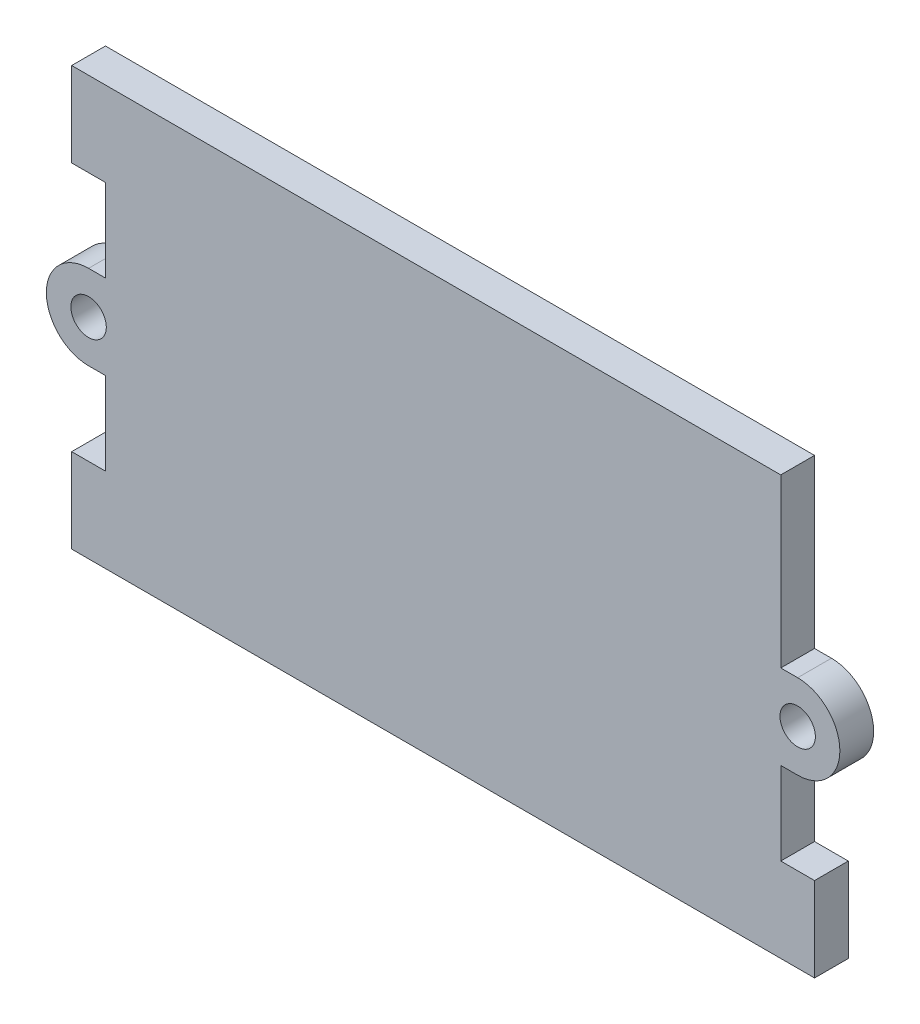
ISO-10303-21;
HEADER;
FILE_DESCRIPTION(('STEP AP214'),'2;1');
FILE_NAME('part.step','',(''),(''),'','','');
FILE_SCHEMA(('AUTOMOTIVE_DESIGN { 1 0 10303 214 1 1 1 1 }'));
ENDSEC;
DATA;
#1=APPLICATION_CONTEXT('core data for automotive mechanical design processes');
#2=APPLICATION_PROTOCOL_DEFINITION('international standard','automotive_design',2000,#1);
#3=PRODUCT_CONTEXT('',#1,'mechanical');
#4=PRODUCT('Part','Part','',(#3));
#5=PRODUCT_RELATED_PRODUCT_CATEGORY('part','',(#4));
#6=PRODUCT_DEFINITION_FORMATION('','',#4);
#7=PRODUCT_DEFINITION_CONTEXT('part definition',#1,'design');
#8=PRODUCT_DEFINITION('design','',#6,#7);
#9=PRODUCT_DEFINITION_SHAPE('','',#8);
#10=(LENGTH_UNIT() NAMED_UNIT(*) SI_UNIT(.MILLI.,.METRE.));
#11=(NAMED_UNIT(*) PLANE_ANGLE_UNIT() SI_UNIT($,.RADIAN.));
#12=(NAMED_UNIT(*) SI_UNIT($,.STERADIAN.) SOLID_ANGLE_UNIT());
#13=UNCERTAINTY_MEASURE_WITH_UNIT(LENGTH_MEASURE(1.E-05),#10,'distance_accuracy_value','');
#14=(GEOMETRIC_REPRESENTATION_CONTEXT(3) GLOBAL_UNCERTAINTY_ASSIGNED_CONTEXT((#13)) GLOBAL_UNIT_ASSIGNED_CONTEXT((#10,
#11,#12)) REPRESENTATION_CONTEXT('',''));
#15=CARTESIAN_POINT('',(0.,0.,0.));
#16=DIRECTION('',(0.,0.,1.));
#17=DIRECTION('',(1.,0.,0.));
#18=AXIS2_PLACEMENT_3D('',#15,#16,#17);
#19=CARTESIAN_POINT('',(80.,0.,4.));
#20=DIRECTION('',(-1.,0.,0.));
#21=DIRECTION('',(0.,0.,1.));
#22=AXIS2_PLACEMENT_3D('',#19,#20,#21);
#23=PLANE('',#22);
#24=DIRECTION('',(0.,0.,1.));
#25=VECTOR('',#24,1.);
#26=CARTESIAN_POINT('',(80.,10.,0.));
#27=LINE('',#26,#25);
#28=CARTESIAN_POINT('',(80.,10.,0.));
#29=VERTEX_POINT('',#28);
#30=CARTESIAN_POINT('',(80.,10.,4.));
#31=VERTEX_POINT('',#30);
#32=EDGE_CURVE('E168',#29,#31,#27,.T.);
#33=ORIENTED_EDGE('',*,*,#32,.F.);
#34=DIRECTION('',(0.,1.,0.));
#35=VECTOR('',#34,1.);
#36=CARTESIAN_POINT('',(80.,0.,0.));
#37=LINE('',#36,#35);
#38=CARTESIAN_POINT('',(80.,19.8074069840839,0.));
#39=VERTEX_POINT('',#38);
#40=EDGE_CURVE('E156',#29,#39,#37,.T.);
#41=ORIENTED_EDGE('',*,*,#40,.T.);
#42=DIRECTION('',(0.,0.,1.));
#43=VECTOR('',#42,1.);
#44=CARTESIAN_POINT('',(80.,19.8074069840839,0.));
#45=LINE('',#44,#43);
#46=CARTESIAN_POINT('',(80.,19.8074069840839,4.));
#47=VERTEX_POINT('',#46);
#48=EDGE_CURVE('E209',#39,#47,#45,.T.);
#49=ORIENTED_EDGE('',*,*,#48,.T.);
#50=DIRECTION('',(0.,1.,0.));
#51=VECTOR('',#50,1.);
#52=CARTESIAN_POINT('',(80.,0.,4.));
#53=LINE('',#52,#51);
#54=EDGE_CURVE('E47',#31,#47,#53,.T.);
#55=ORIENTED_EDGE('',*,*,#54,.F.);
#56=EDGE_LOOP('',(#33,#41,#49,#55));
#57=FACE_BOUND('',#56,.T.);
#58=ADVANCED_FACE('F32',(#57),#23,.F.);
#59=DIRECTION('',(0.,0.,1.));
#60=VECTOR('',#59,1.);
#61=CARTESIAN_POINT('',(80.,29.8074069840839,0.));
#62=LINE('',#61,#60);
#63=CARTESIAN_POINT('',(80.,29.8074069840839,0.));
#64=VERTEX_POINT('',#63);
#65=CARTESIAN_POINT('',(80.,29.8074069840839,4.));
#66=VERTEX_POINT('',#65);
#67=EDGE_CURVE('E207',#64,#66,#62,.T.);
#68=ORIENTED_EDGE('',*,*,#67,.F.);
#69=CARTESIAN_POINT('',(80.,49.6148139681679,0.));
#70=VERTEX_POINT('',#69);
#71=EDGE_CURVE('E166',#64,#70,#37,.T.);
#72=ORIENTED_EDGE('',*,*,#71,.T.);
#73=DIRECTION('',(0.,0.,-1.));
#74=VECTOR('',#73,1.);
#75=CARTESIAN_POINT('',(80.,49.6148139681679,4.));
#76=LINE('',#75,#74);
#77=CARTESIAN_POINT('',(80.,49.6148139681679,4.));
#78=VERTEX_POINT('',#77);
#79=EDGE_CURVE('E11',#78,#70,#76,.T.);
#80=ORIENTED_EDGE('',*,*,#79,.F.);
#81=EDGE_CURVE('E277',#66,#78,#53,.T.);
#82=ORIENTED_EDGE('',*,*,#81,.F.);
#83=EDGE_LOOP('',(#68,#72,#80,#82));
#84=FACE_BOUND('',#83,.T.);
#85=ADVANCED_FACE('F317',(#84),#23,.F.);
#86=CARTESIAN_POINT('',(0.,0.,4.));
#87=DIRECTION('',(-1.,0.,0.));
#88=DIRECTION('',(0.,-1.,0.));
#89=AXIS2_PLACEMENT_3D('',#86,#87,#88);
#90=PLANE('',#89);
#91=DIRECTION('',(0.,1.,0.));
#92=VECTOR('',#91,1.);
#93=CARTESIAN_POINT('',(0.,0.,4.));
#94=LINE('',#93,#92);
#95=CARTESIAN_POINT('',(0.,29.8074069840839,4.));
#96=VERTEX_POINT('',#95);
#97=CARTESIAN_POINT('',(0.,39.6148139681679,4.));
#98=VERTEX_POINT('',#97);
#99=EDGE_CURVE('E283',#96,#98,#94,.T.);
#100=ORIENTED_EDGE('',*,*,#99,.T.);
#101=DIRECTION('',(0.,0.,1.));
#102=VECTOR('',#101,1.);
#103=CARTESIAN_POINT('',(0.,39.6148139681679,0.));
#104=LINE('',#103,#102);
#105=CARTESIAN_POINT('',(0.,39.6148139681679,0.));
#106=VERTEX_POINT('',#105);
#107=EDGE_CURVE('E230',#106,#98,#104,.T.);
#108=ORIENTED_EDGE('',*,*,#107,.F.);
#109=DIRECTION('',(0.,1.,0.));
#110=VECTOR('',#109,1.);
#111=CARTESIAN_POINT('',(0.,0.,0.));
#112=LINE('',#111,#110);
#113=CARTESIAN_POINT('',(0.,29.8074069840839,0.));
#114=VERTEX_POINT('',#113);
#115=EDGE_CURVE('E288',#114,#106,#112,.T.);
#116=ORIENTED_EDGE('',*,*,#115,.F.);
#117=DIRECTION('',(0.,0.,1.));
#118=VECTOR('',#117,1.);
#119=CARTESIAN_POINT('',(0.,29.8074069840839,0.));
#120=LINE('',#119,#118);
#121=EDGE_CURVE('E241',#114,#96,#120,.T.);
#122=ORIENTED_EDGE('',*,*,#121,.T.);
#123=EDGE_LOOP('',(#100,#108,#116,#122));
#124=FACE_BOUND('',#123,.T.);
#125=ADVANCED_FACE('F298',(#124),#90,.T.);
#126=CARTESIAN_POINT('',(0.,10.,4.));
#127=VERTEX_POINT('',#126);
#128=CARTESIAN_POINT('',(0.,19.8074069840839,4.));
#129=VERTEX_POINT('',#128);
#130=EDGE_CURVE('E40',#127,#129,#94,.T.);
#131=ORIENTED_EDGE('',*,*,#130,.T.);
#132=DIRECTION('',(0.,0.,1.));
#133=VECTOR('',#132,1.);
#134=CARTESIAN_POINT('',(0.,19.8074069840839,0.));
#135=LINE('',#134,#133);
#136=CARTESIAN_POINT('',(0.,19.8074069840839,0.));
#137=VERTEX_POINT('',#136);
#138=EDGE_CURVE('E254',#137,#129,#135,.T.);
#139=ORIENTED_EDGE('',*,*,#138,.F.);
#140=CARTESIAN_POINT('',(0.,10.,0.));
#141=VERTEX_POINT('',#140);
#142=EDGE_CURVE('E278',#141,#137,#112,.T.);
#143=ORIENTED_EDGE('',*,*,#142,.F.);
#144=DIRECTION('',(0.,0.,1.));
#145=VECTOR('',#144,1.);
#146=CARTESIAN_POINT('',(0.,10.,0.));
#147=LINE('',#146,#145);
#148=EDGE_CURVE('E263',#141,#127,#147,.T.);
#149=ORIENTED_EDGE('',*,*,#148,.T.);
#150=EDGE_LOOP('',(#131,#139,#143,#149));
#151=FACE_BOUND('',#150,.T.);
#152=ADVANCED_FACE('F344',(#151),#90,.T.);
#153=CARTESIAN_POINT('',(0.,0.,4.));
#154=DIRECTION('',(0.,1.,0.));
#155=DIRECTION('',(0.,0.,1.));
#156=AXIS2_PLACEMENT_3D('',#153,#154,#155);
#157=PLANE('',#156);
#158=DIRECTION('',(1.,0.,0.));
#159=VECTOR('',#158,1.);
#160=CARTESIAN_POINT('',(0.,0.,0.));
#161=LINE('',#160,#159);
#162=CARTESIAN_POINT('',(-4.,0.,0.));
#163=VERTEX_POINT('',#162);
#164=CARTESIAN_POINT('',(84.,0.,0.));
#165=VERTEX_POINT('',#164);
#166=EDGE_CURVE('E274',#163,#165,#161,.T.);
#167=ORIENTED_EDGE('',*,*,#166,.T.);
#168=DIRECTION('',(0.,0.,1.));
#169=VECTOR('',#168,1.);
#170=CARTESIAN_POINT('',(84.,0.,0.));
#171=LINE('',#170,#169);
#172=CARTESIAN_POINT('',(84.,0.,4.));
#173=VERTEX_POINT('',#172);
#174=EDGE_CURVE('E179',#165,#173,#171,.T.);
#175=ORIENTED_EDGE('',*,*,#174,.T.);
#176=DIRECTION('',(1.,0.,0.));
#177=VECTOR('',#176,1.);
#178=CARTESIAN_POINT('',(0.,0.,4.));
#179=LINE('',#178,#177);
#180=CARTESIAN_POINT('',(-4.,0.,4.));
#181=VERTEX_POINT('',#180);
#182=EDGE_CURVE('E275',#181,#173,#179,.T.);
#183=ORIENTED_EDGE('',*,*,#182,.F.);
#184=DIRECTION('',(0.,0.,1.));
#185=VECTOR('',#184,1.);
#186=CARTESIAN_POINT('',(-4.,0.,0.));
#187=LINE('',#186,#185);
#188=EDGE_CURVE('E271',#163,#181,#187,.T.);
#189=ORIENTED_EDGE('',*,*,#188,.F.);
#190=EDGE_LOOP('',(#167,#175,#183,#189));
#191=FACE_BOUND('',#190,.T.);
#192=ADVANCED_FACE('F34',(#191),#157,.F.);
#193=CARTESIAN_POINT('',(0.,49.6148139681679,4.));
#194=DIRECTION('',(0.,1.,0.));
#195=DIRECTION('',(0.,0.,1.));
#196=AXIS2_PLACEMENT_3D('',#193,#194,#195);
#197=PLANE('',#196);
#198=DIRECTION('',(1.,0.,0.));
#199=VECTOR('',#198,1.);
#200=CARTESIAN_POINT('',(0.,49.6148139681679,0.));
#201=LINE('',#200,#199);
#202=CARTESIAN_POINT('',(-3.99999999999999,49.6148139681679,0.));
#203=VERTEX_POINT('',#202);
#204=EDGE_CURVE('E165',#203,#70,#201,.T.);
#205=ORIENTED_EDGE('',*,*,#204,.F.);
#206=DIRECTION('',(0.,0.,1.));
#207=VECTOR('',#206,1.);
#208=CARTESIAN_POINT('',(-3.99999999999999,49.6148139681679,0.));
#209=LINE('',#208,#207);
#210=CARTESIAN_POINT('',(-3.99999999999999,49.6148139681679,4.));
#211=VERTEX_POINT('',#210);
#212=EDGE_CURVE('E221',#203,#211,#209,.T.);
#213=ORIENTED_EDGE('',*,*,#212,.T.);
#214=DIRECTION('',(1.,0.,0.));
#215=VECTOR('',#214,1.);
#216=CARTESIAN_POINT('',(0.,49.6148139681679,4.));
#217=LINE('',#216,#215);
#218=EDGE_CURVE('E280',#211,#78,#217,.T.);
#219=ORIENTED_EDGE('',*,*,#218,.T.);
#220=ORIENTED_EDGE('',*,*,#79,.T.);
#221=EDGE_LOOP('',(#205,#213,#219,#220));
#222=FACE_BOUND('',#221,.T.);
#223=ADVANCED_FACE('F311',(#222),#197,.T.);
#224=CARTESIAN_POINT('',(0.,0.,4.));
#225=DIRECTION('',(0.,0.,1.));
#226=DIRECTION('',(1.,0.,0.));
#227=AXIS2_PLACEMENT_3D('',#224,#225,#226);
#228=PLANE('',#227);
#229=CARTESIAN_POINT('',(-2.,24.8074069840839,4.));
#230=DIRECTION('',(0.,0.,-1.));
#231=DIRECTION('',(-1.,0.,0.));
#232=AXIS2_PLACEMENT_3D('',#229,#230,#231);
#233=CIRCLE('',#232,2.1);
#234=CARTESIAN_POINT('',(-4.1,24.8074069840839,4.));
#235=VERTEX_POINT('',#234);
#236=EDGE_CURVE('E188',#235,#235,#233,.T.);
#237=ORIENTED_EDGE('',*,*,#236,.T.);
#238=EDGE_LOOP('',(#237));
#239=FACE_BOUND('',#238,.T.);
#240=CARTESIAN_POINT('',(82.,24.8074069840839,4.));
#241=DIRECTION('',(0.,0.,-1.));
#242=DIRECTION('',(-1.,0.,0.));
#243=AXIS2_PLACEMENT_3D('',#240,#241,#242);
#244=CIRCLE('',#243,2.1);
#245=CARTESIAN_POINT('',(79.9,24.8074069840839,4.));
#246=VERTEX_POINT('',#245);
#247=EDGE_CURVE('E459',#246,#246,#244,.T.);
#248=ORIENTED_EDGE('',*,*,#247,.T.);
#249=EDGE_LOOP('',(#248));
#250=FACE_BOUND('',#249,.T.);
#251=ORIENTED_EDGE('',*,*,#182,.T.);
#252=DIRECTION('',(0.,-1.,0.));
#253=VECTOR('',#252,1.);
#254=CARTESIAN_POINT('',(84.,0.,4.));
#255=LINE('',#254,#253);
#256=CARTESIAN_POINT('',(84.,10.,4.));
#257=VERTEX_POINT('',#256);
#258=EDGE_CURVE('E177',#257,#173,#255,.T.);
#259=ORIENTED_EDGE('',*,*,#258,.F.);
#260=DIRECTION('',(1.,0.,0.));
#261=VECTOR('',#260,1.);
#262=CARTESIAN_POINT('',(80.,10.,4.));
#263=LINE('',#262,#261);
#264=EDGE_CURVE('E182',#31,#257,#263,.T.);
#265=ORIENTED_EDGE('',*,*,#264,.F.);
#266=ORIENTED_EDGE('',*,*,#54,.T.);
#267=DIRECTION('',(-1.,0.,0.));
#268=VECTOR('',#267,1.);
#269=CARTESIAN_POINT('',(80.,19.8074069840839,4.));
#270=LINE('',#269,#268);
#271=CARTESIAN_POINT('',(82.,19.8074069840839,4.));
#272=VERTEX_POINT('',#271);
#273=EDGE_CURVE('E202',#272,#47,#270,.T.);
#274=ORIENTED_EDGE('',*,*,#273,.F.);
#275=CARTESIAN_POINT('',(82.,24.8074069840839,4.));
#276=DIRECTION('',(0.,0.,-1.));
#277=DIRECTION('',(1.,0.,0.));
#278=AXIS2_PLACEMENT_3D('',#275,#276,#277);
#279=CIRCLE('',#278,5.00000000000002);
#280=CARTESIAN_POINT('',(82.,29.8074069840839,4.));
#281=VERTEX_POINT('',#280);
#282=EDGE_CURVE('E170',#281,#272,#279,.T.);
#283=ORIENTED_EDGE('',*,*,#282,.F.);
#284=DIRECTION('',(1.,0.,0.));
#285=VECTOR('',#284,1.);
#286=CARTESIAN_POINT('',(80.,29.8074069840839,4.));
#287=LINE('',#286,#285);
#288=EDGE_CURVE('E195',#66,#281,#287,.T.);
#289=ORIENTED_EDGE('',*,*,#288,.F.);
#290=ORIENTED_EDGE('',*,*,#81,.T.);
#291=ORIENTED_EDGE('',*,*,#218,.F.);
#292=DIRECTION('',(0.,1.,0.));
#293=VECTOR('',#292,1.);
#294=CARTESIAN_POINT('',(-3.99999999999999,49.6148139681679,4.));
#295=LINE('',#294,#293);
#296=CARTESIAN_POINT('',(-4.,39.6148139681679,4.));
#297=VERTEX_POINT('',#296);
#298=EDGE_CURVE('E218',#297,#211,#295,.T.);
#299=ORIENTED_EDGE('',*,*,#298,.F.);
#300=DIRECTION('',(-1.,0.,0.));
#301=VECTOR('',#300,1.);
#302=CARTESIAN_POINT('',(0.,39.6148139681679,4.));
#303=LINE('',#302,#301);
#304=EDGE_CURVE('E214',#98,#297,#303,.T.);
#305=ORIENTED_EDGE('',*,*,#304,.F.);
#306=ORIENTED_EDGE('',*,*,#99,.F.);
#307=DIRECTION('',(1.,0.,0.));
#308=VECTOR('',#307,1.);
#309=CARTESIAN_POINT('',(0.,29.8074069840839,4.));
#310=LINE('',#309,#308);
#311=CARTESIAN_POINT('',(-2.,29.8074069840839,4.));
#312=VERTEX_POINT('',#311);
#313=EDGE_CURVE('E236',#312,#96,#310,.T.);
#314=ORIENTED_EDGE('',*,*,#313,.F.);
#315=CARTESIAN_POINT('',(-2.,24.8074069840839,4.));
#316=DIRECTION('',(0.,0.,-1.));
#317=DIRECTION('',(-1.,0.,0.));
#318=AXIS2_PLACEMENT_3D('',#315,#316,#317);
#319=CIRCLE('',#318,5.);
#320=CARTESIAN_POINT('',(-2.,19.8074069840839,4.));
#321=VERTEX_POINT('',#320);
#322=EDGE_CURVE('E243',#321,#312,#319,.T.);
#323=ORIENTED_EDGE('',*,*,#322,.F.);
#324=DIRECTION('',(-1.,0.,0.));
#325=VECTOR('',#324,1.);
#326=CARTESIAN_POINT('',(0.,19.8074069840839,4.));
#327=LINE('',#326,#325);
#328=EDGE_CURVE('E232',#129,#321,#327,.T.);
#329=ORIENTED_EDGE('',*,*,#328,.F.);
#330=ORIENTED_EDGE('',*,*,#130,.F.);
#331=DIRECTION('',(1.,0.,0.));
#332=VECTOR('',#331,1.);
#333=CARTESIAN_POINT('',(0.,10.,4.));
#334=LINE('',#333,#332);
#335=CARTESIAN_POINT('',(-4.,10.,4.));
#336=VERTEX_POINT('',#335);
#337=EDGE_CURVE('E261',#336,#127,#334,.T.);
#338=ORIENTED_EDGE('',*,*,#337,.F.);
#339=DIRECTION('',(0.,1.,0.));
#340=VECTOR('',#339,1.);
#341=CARTESIAN_POINT('',(-4.,0.,4.));
#342=LINE('',#341,#340);
#343=EDGE_CURVE('E257',#181,#336,#342,.T.);
#344=ORIENTED_EDGE('',*,*,#343,.F.);
#345=EDGE_LOOP('',(#251,#259,#265,#266,#274,#283,#289,#290,#291,#299,#305,#306,#314,#323,#329,
#330,#338,#344));
#346=FACE_BOUND('',#345,.T.);
#347=ADVANCED_FACE('F304',(#239,#250,#346),#228,.T.);
#348=CARTESIAN_POINT('',(0.,0.,0.));
#349=DIRECTION('',(0.,0.,1.));
#350=DIRECTION('',(1.,0.,0.));
#351=AXIS2_PLACEMENT_3D('',#348,#349,#350);
#352=PLANE('',#351);
#353=CARTESIAN_POINT('',(-2.,24.8074069840839,0.));
#354=DIRECTION('',(0.,0.,-1.));
#355=DIRECTION('',(-1.,0.,0.));
#356=AXIS2_PLACEMENT_3D('',#353,#354,#355);
#357=CIRCLE('',#356,2.1);
#358=CARTESIAN_POINT('',(-4.1,24.8074069840839,0.));
#359=VERTEX_POINT('',#358);
#360=EDGE_CURVE('E458',#359,#359,#357,.T.);
#361=ORIENTED_EDGE('',*,*,#360,.F.);
#362=EDGE_LOOP('',(#361));
#363=FACE_BOUND('',#362,.T.);
#364=CARTESIAN_POINT('',(82.,24.8074069840839,0.));
#365=DIRECTION('',(0.,0.,-1.));
#366=DIRECTION('',(-1.,0.,0.));
#367=AXIS2_PLACEMENT_3D('',#364,#365,#366);
#368=CIRCLE('',#367,2.1);
#369=CARTESIAN_POINT('',(79.9,24.8074069840839,0.));
#370=VERTEX_POINT('',#369);
#371=EDGE_CURVE('E185',#370,#370,#368,.T.);
#372=ORIENTED_EDGE('',*,*,#371,.F.);
#373=EDGE_LOOP('',(#372));
#374=FACE_BOUND('',#373,.T.);
#375=ORIENTED_EDGE('',*,*,#166,.F.);
#376=DIRECTION('',(0.,1.,0.));
#377=VECTOR('',#376,1.);
#378=CARTESIAN_POINT('',(-4.,0.,0.));
#379=LINE('',#378,#377);
#380=CARTESIAN_POINT('',(-4.,10.,0.));
#381=VERTEX_POINT('',#380);
#382=EDGE_CURVE('E258',#163,#381,#379,.T.);
#383=ORIENTED_EDGE('',*,*,#382,.T.);
#384=DIRECTION('',(1.,0.,0.));
#385=VECTOR('',#384,1.);
#386=CARTESIAN_POINT('',(0.,10.,0.));
#387=LINE('',#386,#385);
#388=EDGE_CURVE('E260',#381,#141,#387,.T.);
#389=ORIENTED_EDGE('',*,*,#388,.T.);
#390=ORIENTED_EDGE('',*,*,#142,.T.);
#391=DIRECTION('',(-1.,0.,0.));
#392=VECTOR('',#391,1.);
#393=CARTESIAN_POINT('',(0.,19.8074069840839,0.));
#394=LINE('',#393,#392);
#395=CARTESIAN_POINT('',(-2.,19.8074069840839,0.));
#396=VERTEX_POINT('',#395);
#397=EDGE_CURVE('E233',#137,#396,#394,.T.);
#398=ORIENTED_EDGE('',*,*,#397,.T.);
#399=CARTESIAN_POINT('',(-2.,24.8074069840839,0.));
#400=DIRECTION('',(0.,0.,-1.));
#401=DIRECTION('',(-1.,0.,0.));
#402=AXIS2_PLACEMENT_3D('',#399,#400,#401);
#403=CIRCLE('',#402,5.);
#404=CARTESIAN_POINT('',(-2.,29.8074069840839,0.));
#405=VERTEX_POINT('',#404);
#406=EDGE_CURVE('E235',#396,#405,#403,.T.);
#407=ORIENTED_EDGE('',*,*,#406,.T.);
#408=DIRECTION('',(1.,0.,0.));
#409=VECTOR('',#408,1.);
#410=CARTESIAN_POINT('',(0.,29.8074069840839,0.));
#411=LINE('',#410,#409);
#412=EDGE_CURVE('E238',#405,#114,#411,.T.);
#413=ORIENTED_EDGE('',*,*,#412,.T.);
#414=ORIENTED_EDGE('',*,*,#115,.T.);
#415=DIRECTION('',(-1.,0.,0.));
#416=VECTOR('',#415,1.);
#417=CARTESIAN_POINT('',(0.,39.6148139681679,0.));
#418=LINE('',#417,#416);
#419=CARTESIAN_POINT('',(-4.,39.6148139681679,0.));
#420=VERTEX_POINT('',#419);
#421=EDGE_CURVE('E215',#106,#420,#418,.T.);
#422=ORIENTED_EDGE('',*,*,#421,.T.);
#423=DIRECTION('',(0.,1.,0.));
#424=VECTOR('',#423,1.);
#425=CARTESIAN_POINT('',(-3.99999999999999,49.6148139681679,0.));
#426=LINE('',#425,#424);
#427=EDGE_CURVE('E217',#420,#203,#426,.T.);
#428=ORIENTED_EDGE('',*,*,#427,.T.);
#429=ORIENTED_EDGE('',*,*,#204,.T.);
#430=ORIENTED_EDGE('',*,*,#71,.F.);
#431=DIRECTION('',(1.,0.,0.));
#432=VECTOR('',#431,1.);
#433=CARTESIAN_POINT('',(80.,29.8074069840839,0.));
#434=LINE('',#433,#432);
#435=CARTESIAN_POINT('',(82.,29.8074069840839,0.));
#436=VERTEX_POINT('',#435);
#437=EDGE_CURVE('E197',#64,#436,#434,.T.);
#438=ORIENTED_EDGE('',*,*,#437,.T.);
#439=CARTESIAN_POINT('',(82.,24.8074069840839,0.));
#440=DIRECTION('',(0.,0.,-1.));
#441=DIRECTION('',(1.,0.,0.));
#442=AXIS2_PLACEMENT_3D('',#439,#440,#441);
#443=CIRCLE('',#442,5.00000000000002);
#444=CARTESIAN_POINT('',(82.,19.8074069840839,0.));
#445=VERTEX_POINT('',#444);
#446=EDGE_CURVE('E193',#436,#445,#443,.T.);
#447=ORIENTED_EDGE('',*,*,#446,.T.);
#448=DIRECTION('',(-1.,0.,0.));
#449=VECTOR('',#448,1.);
#450=CARTESIAN_POINT('',(80.,19.8074069840839,0.));
#451=LINE('',#450,#449);
#452=EDGE_CURVE('E163',#445,#39,#451,.T.);
#453=ORIENTED_EDGE('',*,*,#452,.T.);
#454=ORIENTED_EDGE('',*,*,#40,.F.);
#455=DIRECTION('',(1.,0.,0.));
#456=VECTOR('',#455,1.);
#457=CARTESIAN_POINT('',(80.,10.,0.));
#458=LINE('',#457,#456);
#459=CARTESIAN_POINT('',(84.,10.,0.));
#460=VERTEX_POINT('',#459);
#461=EDGE_CURVE('E160',#29,#460,#458,.T.);
#462=ORIENTED_EDGE('',*,*,#461,.T.);
#463=DIRECTION('',(0.,-1.,0.));
#464=VECTOR('',#463,1.);
#465=CARTESIAN_POINT('',(84.,0.,0.));
#466=LINE('',#465,#464);
#467=EDGE_CURVE('E176',#460,#165,#466,.T.);
#468=ORIENTED_EDGE('',*,*,#467,.T.);
#469=EDGE_LOOP('',(#375,#383,#389,#390,#398,#407,#413,#414,#422,#428,#429,#430,#438,#447,#453,
#454,#462,#468));
#470=FACE_BOUND('',#469,.T.);
#471=ADVANCED_FACE('F157',(#363,#374,#470),#352,.F.);
#472=CARTESIAN_POINT('',(-4.,0.,0.));
#473=DIRECTION('',(1.,0.,0.));
#474=DIRECTION('',(0.,0.,-1.));
#475=AXIS2_PLACEMENT_3D('',#472,#473,#474);
#476=PLANE('',#475);
#477=ORIENTED_EDGE('',*,*,#343,.T.);
#478=DIRECTION('',(0.,0.,1.));
#479=VECTOR('',#478,1.);
#480=CARTESIAN_POINT('',(-4.,10.,0.));
#481=LINE('',#480,#479);
#482=EDGE_CURVE('E268',#381,#336,#481,.T.);
#483=ORIENTED_EDGE('',*,*,#482,.F.);
#484=ORIENTED_EDGE('',*,*,#382,.F.);
#485=ORIENTED_EDGE('',*,*,#188,.T.);
#486=EDGE_LOOP('',(#477,#483,#484,#485));
#487=FACE_BOUND('',#486,.T.);
#488=ADVANCED_FACE('F350',(#487),#476,.F.);
#489=CARTESIAN_POINT('',(0.,10.,0.));
#490=DIRECTION('',(0.,-1.,0.));
#491=DIRECTION('',(0.,0.,-1.));
#492=AXIS2_PLACEMENT_3D('',#489,#490,#491);
#493=PLANE('',#492);
#494=ORIENTED_EDGE('',*,*,#337,.T.);
#495=ORIENTED_EDGE('',*,*,#148,.F.);
#496=ORIENTED_EDGE('',*,*,#388,.F.);
#497=ORIENTED_EDGE('',*,*,#482,.T.);
#498=EDGE_LOOP('',(#494,#495,#496,#497));
#499=FACE_BOUND('',#498,.T.);
#500=ADVANCED_FACE('F357',(#499),#493,.F.);
#501=CARTESIAN_POINT('',(0.,19.8074069840839,0.));
#502=DIRECTION('',(0.,1.,0.));
#503=DIRECTION('',(0.,0.,1.));
#504=AXIS2_PLACEMENT_3D('',#501,#502,#503);
#505=PLANE('',#504);
#506=ORIENTED_EDGE('',*,*,#328,.T.);
#507=DIRECTION('',(0.,0.,1.));
#508=VECTOR('',#507,1.);
#509=CARTESIAN_POINT('',(-2.,19.8074069840839,0.));
#510=LINE('',#509,#508);
#511=EDGE_CURVE('E251',#396,#321,#510,.T.);
#512=ORIENTED_EDGE('',*,*,#511,.F.);
#513=ORIENTED_EDGE('',*,*,#397,.F.);
#514=ORIENTED_EDGE('',*,*,#138,.T.);
#515=EDGE_LOOP('',(#506,#512,#513,#514));
#516=FACE_BOUND('',#515,.T.);
#517=ADVANCED_FACE('F361',(#516),#505,.F.);
#518=CARTESIAN_POINT('',(-2.,24.8074069840839,0.));
#519=DIRECTION('',(0.,0.,1.));
#520=DIRECTION('',(1.,0.,0.));
#521=AXIS2_PLACEMENT_3D('',#518,#519,#520);
#522=CYLINDRICAL_SURFACE('',#521,5.);
#523=ORIENTED_EDGE('',*,*,#322,.T.);
#524=DIRECTION('',(0.,0.,1.));
#525=VECTOR('',#524,1.);
#526=CARTESIAN_POINT('',(-2.,29.8074069840839,0.));
#527=LINE('',#526,#525);
#528=EDGE_CURVE('E248',#405,#312,#527,.T.);
#529=ORIENTED_EDGE('',*,*,#528,.F.);
#530=ORIENTED_EDGE('',*,*,#406,.F.);
#531=ORIENTED_EDGE('',*,*,#511,.T.);
#532=EDGE_LOOP('',(#523,#529,#530,#531));
#533=FACE_BOUND('',#532,.T.);
#534=ADVANCED_FACE('F365',(#533),#522,.T.);
#535=CARTESIAN_POINT('',(0.,29.8074069840839,0.));
#536=DIRECTION('',(0.,-1.,0.));
#537=DIRECTION('',(0.,0.,-1.));
#538=AXIS2_PLACEMENT_3D('',#535,#536,#537);
#539=PLANE('',#538);
#540=ORIENTED_EDGE('',*,*,#313,.T.);
#541=ORIENTED_EDGE('',*,*,#121,.F.);
#542=ORIENTED_EDGE('',*,*,#412,.F.);
#543=ORIENTED_EDGE('',*,*,#528,.T.);
#544=EDGE_LOOP('',(#540,#541,#542,#543));
#545=FACE_BOUND('',#544,.T.);
#546=ADVANCED_FACE('F369',(#545),#539,.F.);
#547=CARTESIAN_POINT('',(0.,39.6148139681679,0.));
#548=DIRECTION('',(0.,1.,0.));
#549=DIRECTION('',(-1.,0.,0.));
#550=AXIS2_PLACEMENT_3D('',#547,#548,#549);
#551=PLANE('',#550);
#552=ORIENTED_EDGE('',*,*,#304,.T.);
#553=DIRECTION('',(0.,0.,1.));
#554=VECTOR('',#553,1.);
#555=CARTESIAN_POINT('',(-4.,39.6148139681679,0.));
#556=LINE('',#555,#554);
#557=EDGE_CURVE('E227',#420,#297,#556,.T.);
#558=ORIENTED_EDGE('',*,*,#557,.F.);
#559=ORIENTED_EDGE('',*,*,#421,.F.);
#560=ORIENTED_EDGE('',*,*,#107,.T.);
#561=EDGE_LOOP('',(#552,#558,#559,#560));
#562=FACE_BOUND('',#561,.T.);
#563=ADVANCED_FACE('F302',(#562),#551,.F.);
#564=CARTESIAN_POINT('',(-3.99999999999999,49.6148139681679,0.));
#565=DIRECTION('',(1.,0.,0.));
#566=DIRECTION('',(0.,1.,0.));
#567=AXIS2_PLACEMENT_3D('',#564,#565,#566);
#568=PLANE('',#567);
#569=ORIENTED_EDGE('',*,*,#298,.T.);
#570=ORIENTED_EDGE('',*,*,#212,.F.);
#571=ORIENTED_EDGE('',*,*,#427,.F.);
#572=ORIENTED_EDGE('',*,*,#557,.T.);
#573=EDGE_LOOP('',(#569,#570,#571,#572));
#574=FACE_BOUND('',#573,.T.);
#575=ADVANCED_FACE('F308',(#574),#568,.F.);
#576=CARTESIAN_POINT('',(82.,24.8074069840839,0.));
#577=DIRECTION('',(0.,0.,1.));
#578=DIRECTION('',(1.,0.,0.));
#579=AXIS2_PLACEMENT_3D('',#576,#577,#578);
#580=CYLINDRICAL_SURFACE('',#579,5.00000000000002);
#581=ORIENTED_EDGE('',*,*,#282,.T.);
#582=DIRECTION('',(0.,0.,1.));
#583=VECTOR('',#582,1.);
#584=CARTESIAN_POINT('',(82.,19.8074069840839,0.));
#585=LINE('',#584,#583);
#586=EDGE_CURVE('E211',#445,#272,#585,.T.);
#587=ORIENTED_EDGE('',*,*,#586,.F.);
#588=ORIENTED_EDGE('',*,*,#446,.F.);
#589=DIRECTION('',(0.,0.,1.));
#590=VECTOR('',#589,1.);
#591=CARTESIAN_POINT('',(82.,29.8074069840839,0.));
#592=LINE('',#591,#590);
#593=EDGE_CURVE('E199',#436,#281,#592,.T.);
#594=ORIENTED_EDGE('',*,*,#593,.T.);
#595=EDGE_LOOP('',(#581,#587,#588,#594));
#596=FACE_BOUND('',#595,.T.);
#597=ADVANCED_FACE('F325',(#596),#580,.T.);
#598=CARTESIAN_POINT('',(80.,19.8074069840839,0.));
#599=DIRECTION('',(0.,1.,0.));
#600=DIRECTION('',(-1.,0.,0.));
#601=AXIS2_PLACEMENT_3D('',#598,#599,#600);
#602=PLANE('',#601);
#603=ORIENTED_EDGE('',*,*,#273,.T.);
#604=ORIENTED_EDGE('',*,*,#48,.F.);
#605=ORIENTED_EDGE('',*,*,#452,.F.);
#606=ORIENTED_EDGE('',*,*,#586,.T.);
#607=EDGE_LOOP('',(#603,#604,#605,#606));
#608=FACE_BOUND('',#607,.T.);
#609=ADVANCED_FACE('F328',(#608),#602,.F.);
#610=CARTESIAN_POINT('',(80.,29.8074069840839,0.));
#611=DIRECTION('',(0.,-1.,0.));
#612=DIRECTION('',(1.,0.,0.));
#613=AXIS2_PLACEMENT_3D('',#610,#611,#612);
#614=PLANE('',#613);
#615=ORIENTED_EDGE('',*,*,#288,.T.);
#616=ORIENTED_EDGE('',*,*,#593,.F.);
#617=ORIENTED_EDGE('',*,*,#437,.F.);
#618=ORIENTED_EDGE('',*,*,#67,.T.);
#619=EDGE_LOOP('',(#615,#616,#617,#618));
#620=FACE_BOUND('',#619,.T.);
#621=ADVANCED_FACE('F321',(#620),#614,.F.);
#622=CARTESIAN_POINT('',(80.,10.,0.));
#623=DIRECTION('',(0.,-1.,0.));
#624=DIRECTION('',(1.,0.,0.));
#625=AXIS2_PLACEMENT_3D('',#622,#623,#624);
#626=PLANE('',#625);
#627=ORIENTED_EDGE('',*,*,#264,.T.);
#628=DIRECTION('',(0.,0.,1.));
#629=VECTOR('',#628,1.);
#630=CARTESIAN_POINT('',(84.,10.,0.));
#631=LINE('',#630,#629);
#632=EDGE_CURVE('E171',#460,#257,#631,.T.);
#633=ORIENTED_EDGE('',*,*,#632,.F.);
#634=ORIENTED_EDGE('',*,*,#461,.F.);
#635=ORIENTED_EDGE('',*,*,#32,.T.);
#636=EDGE_LOOP('',(#627,#633,#634,#635));
#637=FACE_BOUND('',#636,.T.);
#638=ADVANCED_FACE('F173',(#637),#626,.F.);
#639=CARTESIAN_POINT('',(84.,0.,0.));
#640=DIRECTION('',(-1.,0.,0.));
#641=DIRECTION('',(0.,0.,1.));
#642=AXIS2_PLACEMENT_3D('',#639,#640,#641);
#643=PLANE('',#642);
#644=ORIENTED_EDGE('',*,*,#258,.T.);
#645=ORIENTED_EDGE('',*,*,#174,.F.);
#646=ORIENTED_EDGE('',*,*,#467,.F.);
#647=ORIENTED_EDGE('',*,*,#632,.T.);
#648=EDGE_LOOP('',(#644,#645,#646,#647));
#649=FACE_BOUND('',#648,.T.);
#650=ADVANCED_FACE('F404',(#649),#643,.F.);
#651=CARTESIAN_POINT('',(82.,24.8074069840839,4.));
#652=DIRECTION('',(0.,0.,-1.));
#653=DIRECTION('',(-1.,0.,0.));
#654=AXIS2_PLACEMENT_3D('',#651,#652,#653);
#655=CYLINDRICAL_SURFACE('',#654,2.1);
#656=ORIENTED_EDGE('',*,*,#247,.F.);
#657=EDGE_LOOP('',(#656));
#658=FACE_BOUND('',#657,.T.);
#659=ORIENTED_EDGE('',*,*,#371,.T.);
#660=EDGE_LOOP('',(#659));
#661=FACE_BOUND('',#660,.T.);
#662=ADVANCED_FACE('F413',(#658,#661),#655,.F.);
#663=CARTESIAN_POINT('',(-2.,24.8074069840839,4.));
#664=DIRECTION('',(0.,0.,-1.));
#665=DIRECTION('',(-1.,0.,0.));
#666=AXIS2_PLACEMENT_3D('',#663,#664,#665);
#667=CYLINDRICAL_SURFACE('',#666,2.1);
#668=ORIENTED_EDGE('',*,*,#236,.F.);
#669=EDGE_LOOP('',(#668));
#670=FACE_BOUND('',#669,.T.);
#671=ORIENTED_EDGE('',*,*,#360,.T.);
#672=EDGE_LOOP('',(#671));
#673=FACE_BOUND('',#672,.T.);
#674=ADVANCED_FACE('F439',(#670,#673),#667,.F.);
#675=CLOSED_SHELL('',(#58,#85,#125,#152,#192,#223,#347,#471,#488,#500,#517,#534,#546,#563,#575,
#597,#609,#621,#638,#650,#662,#674));
#676=MANIFOLD_SOLID_BREP('B2',#675);
#677=ADVANCED_BREP_SHAPE_REPRESENTATION('',(#18,#676),#14);
#678=SHAPE_DEFINITION_REPRESENTATION(#9,#677);
ENDSEC;
END-ISO-10303-21;
